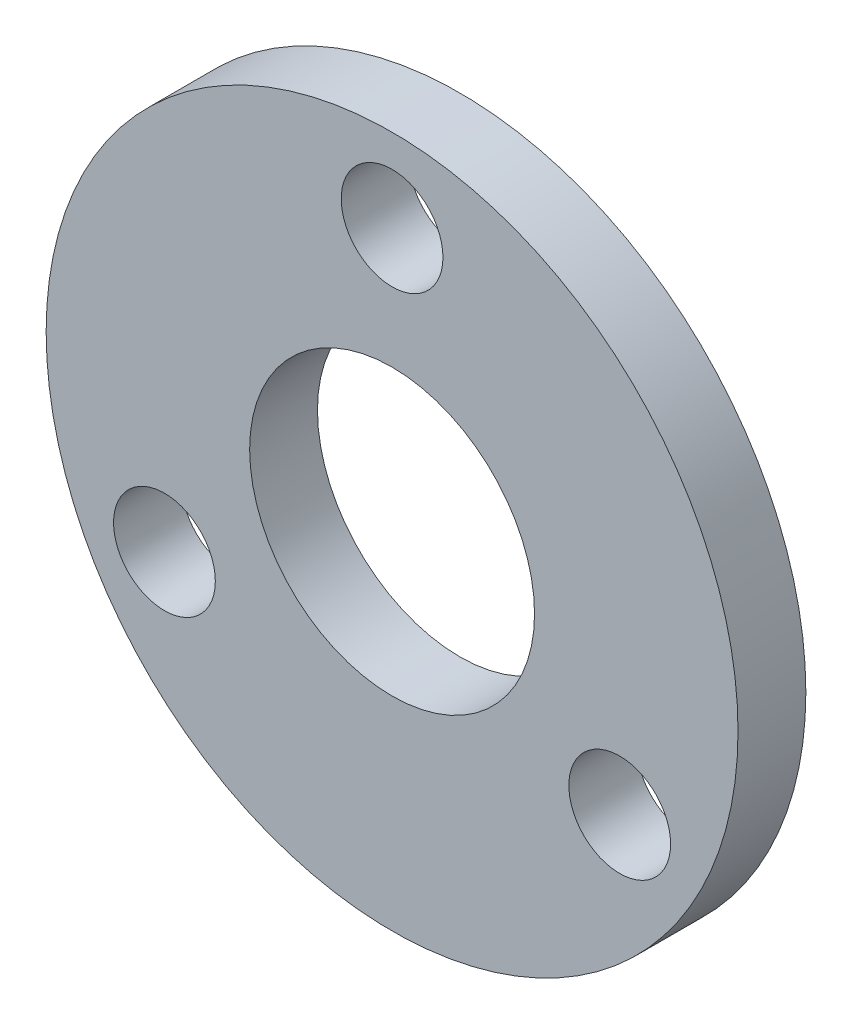
ISO-10303-21;
HEADER;
FILE_DESCRIPTION(('STEP AP214'),'2;1');
FILE_NAME('part.step','',(''),(''),'','','');
FILE_SCHEMA(('AUTOMOTIVE_DESIGN { 1 0 10303 214 1 1 1 1 }'));
ENDSEC;
DATA;
#1=APPLICATION_CONTEXT('core data for automotive mechanical design processes');
#2=APPLICATION_PROTOCOL_DEFINITION('international standard','automotive_design',2000,#1);
#3=PRODUCT_CONTEXT('',#1,'mechanical');
#4=PRODUCT('Part','Part','',(#3));
#5=PRODUCT_RELATED_PRODUCT_CATEGORY('part','',(#4));
#6=PRODUCT_DEFINITION_FORMATION('','',#4);
#7=PRODUCT_DEFINITION_CONTEXT('part definition',#1,'design');
#8=PRODUCT_DEFINITION('design','',#6,#7);
#9=PRODUCT_DEFINITION_SHAPE('','',#8);
#10=(LENGTH_UNIT() NAMED_UNIT(*) SI_UNIT(.MILLI.,.METRE.));
#11=(NAMED_UNIT(*) PLANE_ANGLE_UNIT() SI_UNIT($,.RADIAN.));
#12=(NAMED_UNIT(*) SI_UNIT($,.STERADIAN.) SOLID_ANGLE_UNIT());
#13=UNCERTAINTY_MEASURE_WITH_UNIT(LENGTH_MEASURE(1.E-05),#10,'distance_accuracy_value','');
#14=(GEOMETRIC_REPRESENTATION_CONTEXT(3) GLOBAL_UNCERTAINTY_ASSIGNED_CONTEXT((#13)) GLOBAL_UNIT_ASSIGNED_CONTEXT((#10,
#11,#12)) REPRESENTATION_CONTEXT('',''));
#15=CARTESIAN_POINT('',(0.,0.,0.));
#16=DIRECTION('',(0.,0.,1.));
#17=DIRECTION('',(1.,0.,0.));
#18=AXIS2_PLACEMENT_3D('',#15,#16,#17);
#19=CARTESIAN_POINT('',(0.,0.,1.));
#20=DIRECTION('',(0.,0.,1.));
#21=DIRECTION('',(1.,0.,0.));
#22=AXIS2_PLACEMENT_3D('',#19,#20,#21);
#23=PLANE('',#22);
#24=CARTESIAN_POINT('',(6.7116968793294,-3.875,1.));
#25=DIRECTION('',(0.,0.,1.));
#26=DIRECTION('',(1.,0.,0.));
#27=AXIS2_PLACEMENT_3D('',#24,#25,#26);
#28=CIRCLE('',#27,1.5);
#29=CARTESIAN_POINT('',(8.2116968793294,-3.875,1.));
#30=VERTEX_POINT('',#29);
#31=EDGE_CURVE('E57',#30,#30,#28,.T.);
#32=ORIENTED_EDGE('',*,*,#31,.F.);
#33=EDGE_LOOP('',(#32));
#34=FACE_BOUND('',#33,.T.);
#35=CARTESIAN_POINT('',(-6.7116968793294,-3.875,1.));
#36=DIRECTION('',(0.,0.,1.));
#37=DIRECTION('',(1.,0.,0.));
#38=AXIS2_PLACEMENT_3D('',#35,#36,#37);
#39=CIRCLE('',#38,1.5);
#40=CARTESIAN_POINT('',(-5.2116968793294,-3.875,1.));
#41=VERTEX_POINT('',#40);
#42=EDGE_CURVE('E46',#41,#41,#39,.T.);
#43=ORIENTED_EDGE('',*,*,#42,.F.);
#44=EDGE_LOOP('',(#43));
#45=FACE_BOUND('',#44,.T.);
#46=CARTESIAN_POINT('',(0.,0.,1.));
#47=DIRECTION('',(0.,0.,1.));
#48=DIRECTION('',(1.,0.,0.));
#49=AXIS2_PLACEMENT_3D('',#46,#47,#48);
#50=CIRCLE('',#49,10.2);
#51=CARTESIAN_POINT('',(10.2,0.,1.));
#52=VERTEX_POINT('',#51);
#53=EDGE_CURVE('E10',#52,#52,#50,.T.);
#54=ORIENTED_EDGE('',*,*,#53,.T.);
#55=EDGE_LOOP('',(#54));
#56=FACE_BOUND('',#55,.T.);
#57=CARTESIAN_POINT('',(0.,7.75,1.));
#58=DIRECTION('',(0.,0.,1.));
#59=DIRECTION('',(1.,0.,0.));
#60=AXIS2_PLACEMENT_3D('',#57,#58,#59);
#61=CIRCLE('',#60,1.5);
#62=CARTESIAN_POINT('',(1.5,7.75,1.));
#63=VERTEX_POINT('',#62);
#64=EDGE_CURVE('E51',#63,#63,#61,.T.);
#65=ORIENTED_EDGE('',*,*,#64,.F.);
#66=EDGE_LOOP('',(#65));
#67=FACE_BOUND('',#66,.T.);
#68=CARTESIAN_POINT('',(0.,0.,1.));
#69=DIRECTION('',(0.,0.,1.));
#70=DIRECTION('',(1.,0.,0.));
#71=AXIS2_PLACEMENT_3D('',#68,#69,#70);
#72=CIRCLE('',#71,4.2);
#73=CARTESIAN_POINT('',(4.2,0.,1.));
#74=VERTEX_POINT('',#73);
#75=EDGE_CURVE('E63',#74,#74,#72,.T.);
#76=ORIENTED_EDGE('',*,*,#75,.F.);
#77=EDGE_LOOP('',(#76));
#78=FACE_BOUND('',#77,.T.);
#79=ADVANCED_FACE('F35',(#34,#45,#56,#67,#78),#23,.T.);
#80=CARTESIAN_POINT('',(0.,0.,-1.));
#81=DIRECTION('',(0.,0.,1.));
#82=DIRECTION('',(1.,0.,0.));
#83=AXIS2_PLACEMENT_3D('',#80,#81,#82);
#84=PLANE('',#83);
#85=CARTESIAN_POINT('',(0.,0.,-1.));
#86=DIRECTION('',(0.,0.,1.));
#87=DIRECTION('',(1.,0.,0.));
#88=AXIS2_PLACEMENT_3D('',#85,#86,#87);
#89=CIRCLE('',#88,10.2);
#90=CARTESIAN_POINT('',(10.2,0.,-1.));
#91=VERTEX_POINT('',#90);
#92=EDGE_CURVE('E39',#91,#91,#89,.T.);
#93=ORIENTED_EDGE('',*,*,#92,.F.);
#94=EDGE_LOOP('',(#93));
#95=FACE_BOUND('',#94,.T.);
#96=CARTESIAN_POINT('',(-6.7116968793294,-3.875,-1.));
#97=DIRECTION('',(0.,0.,1.));
#98=DIRECTION('',(1.,0.,0.));
#99=AXIS2_PLACEMENT_3D('',#96,#97,#98);
#100=CIRCLE('',#99,1.5);
#101=CARTESIAN_POINT('',(-5.2116968793294,-3.875,-1.));
#102=VERTEX_POINT('',#101);
#103=EDGE_CURVE('E48',#102,#102,#100,.T.);
#104=ORIENTED_EDGE('',*,*,#103,.T.);
#105=EDGE_LOOP('',(#104));
#106=FACE_BOUND('',#105,.T.);
#107=CARTESIAN_POINT('',(0.,7.75,-1.));
#108=DIRECTION('',(0.,0.,1.));
#109=DIRECTION('',(1.,0.,0.));
#110=AXIS2_PLACEMENT_3D('',#107,#108,#109);
#111=CIRCLE('',#110,1.5);
#112=CARTESIAN_POINT('',(1.5,7.75,-1.));
#113=VERTEX_POINT('',#112);
#114=EDGE_CURVE('E54',#113,#113,#111,.T.);
#115=ORIENTED_EDGE('',*,*,#114,.T.);
#116=EDGE_LOOP('',(#115));
#117=FACE_BOUND('',#116,.T.);
#118=CARTESIAN_POINT('',(6.7116968793294,-3.875,-1.));
#119=DIRECTION('',(0.,0.,1.));
#120=DIRECTION('',(1.,0.,0.));
#121=AXIS2_PLACEMENT_3D('',#118,#119,#120);
#122=CIRCLE('',#121,1.5);
#123=CARTESIAN_POINT('',(8.2116968793294,-3.875,-1.));
#124=VERTEX_POINT('',#123);
#125=EDGE_CURVE('E60',#124,#124,#122,.T.);
#126=ORIENTED_EDGE('',*,*,#125,.T.);
#127=EDGE_LOOP('',(#126));
#128=FACE_BOUND('',#127,.T.);
#129=CARTESIAN_POINT('',(0.,0.,-1.));
#130=DIRECTION('',(0.,0.,1.));
#131=DIRECTION('',(1.,0.,0.));
#132=AXIS2_PLACEMENT_3D('',#129,#130,#131);
#133=CIRCLE('',#132,4.2);
#134=CARTESIAN_POINT('',(4.2,0.,-1.));
#135=VERTEX_POINT('',#134);
#136=EDGE_CURVE('E66',#135,#135,#133,.T.);
#137=ORIENTED_EDGE('',*,*,#136,.T.);
#138=EDGE_LOOP('',(#137));
#139=FACE_BOUND('',#138,.T.);
#140=ADVANCED_FACE('F76',(#95,#106,#117,#128,#139),#84,.F.);
#141=CARTESIAN_POINT('',(0.,0.,1.));
#142=DIRECTION('',(0.,0.,-1.));
#143=DIRECTION('',(-1.,0.,0.));
#144=AXIS2_PLACEMENT_3D('',#141,#142,#143);
#145=CYLINDRICAL_SURFACE('',#144,10.2);
#146=ORIENTED_EDGE('',*,*,#53,.F.);
#147=EDGE_LOOP('',(#146));
#148=FACE_BOUND('',#147,.T.);
#149=ORIENTED_EDGE('',*,*,#92,.T.);
#150=EDGE_LOOP('',(#149));
#151=FACE_BOUND('',#150,.T.);
#152=ADVANCED_FACE('F37',(#148,#151),#145,.T.);
#153=CARTESIAN_POINT('',(-6.7116968793294,-3.875,1.));
#154=DIRECTION('',(0.,0.,-1.));
#155=DIRECTION('',(-1.,0.,0.));
#156=AXIS2_PLACEMENT_3D('',#153,#154,#155);
#157=CYLINDRICAL_SURFACE('',#156,1.5);
#158=ORIENTED_EDGE('',*,*,#42,.T.);
#159=EDGE_LOOP('',(#158));
#160=FACE_BOUND('',#159,.T.);
#161=ORIENTED_EDGE('',*,*,#103,.F.);
#162=EDGE_LOOP('',(#161));
#163=FACE_BOUND('',#162,.T.);
#164=ADVANCED_FACE('F86',(#160,#163),#157,.F.);
#165=CARTESIAN_POINT('',(0.,7.75,1.));
#166=DIRECTION('',(0.,0.,-1.));
#167=DIRECTION('',(-1.,0.,0.));
#168=AXIS2_PLACEMENT_3D('',#165,#166,#167);
#169=CYLINDRICAL_SURFACE('',#168,1.5);
#170=ORIENTED_EDGE('',*,*,#64,.T.);
#171=EDGE_LOOP('',(#170));
#172=FACE_BOUND('',#171,.T.);
#173=ORIENTED_EDGE('',*,*,#114,.F.);
#174=EDGE_LOOP('',(#173));
#175=FACE_BOUND('',#174,.T.);
#176=ADVANCED_FACE('F89',(#172,#175),#169,.F.);
#177=CARTESIAN_POINT('',(6.7116968793294,-3.875,1.));
#178=DIRECTION('',(0.,0.,-1.));
#179=DIRECTION('',(-1.,0.,0.));
#180=AXIS2_PLACEMENT_3D('',#177,#178,#179);
#181=CYLINDRICAL_SURFACE('',#180,1.5);
#182=ORIENTED_EDGE('',*,*,#31,.T.);
#183=EDGE_LOOP('',(#182));
#184=FACE_BOUND('',#183,.T.);
#185=ORIENTED_EDGE('',*,*,#125,.F.);
#186=EDGE_LOOP('',(#185));
#187=FACE_BOUND('',#186,.T.);
#188=ADVANCED_FACE('F93',(#184,#187),#181,.F.);
#189=CARTESIAN_POINT('',(0.,0.,1.));
#190=DIRECTION('',(0.,0.,-1.));
#191=DIRECTION('',(-1.,0.,0.));
#192=AXIS2_PLACEMENT_3D('',#189,#190,#191);
#193=CYLINDRICAL_SURFACE('',#192,4.2);
#194=ORIENTED_EDGE('',*,*,#75,.T.);
#195=EDGE_LOOP('',(#194));
#196=FACE_BOUND('',#195,.T.);
#197=ORIENTED_EDGE('',*,*,#136,.F.);
#198=EDGE_LOOP('',(#197));
#199=FACE_BOUND('',#198,.T.);
#200=ADVANCED_FACE('F72',(#196,#199),#193,.F.);
#201=CLOSED_SHELL('',(#79,#140,#152,#164,#176,#188,#200));
#202=MANIFOLD_SOLID_BREP('B2',#201);
#203=ADVANCED_BREP_SHAPE_REPRESENTATION('',(#18,#202),#14);
#204=SHAPE_DEFINITION_REPRESENTATION(#9,#203);
ENDSEC;
END-ISO-10303-21;
